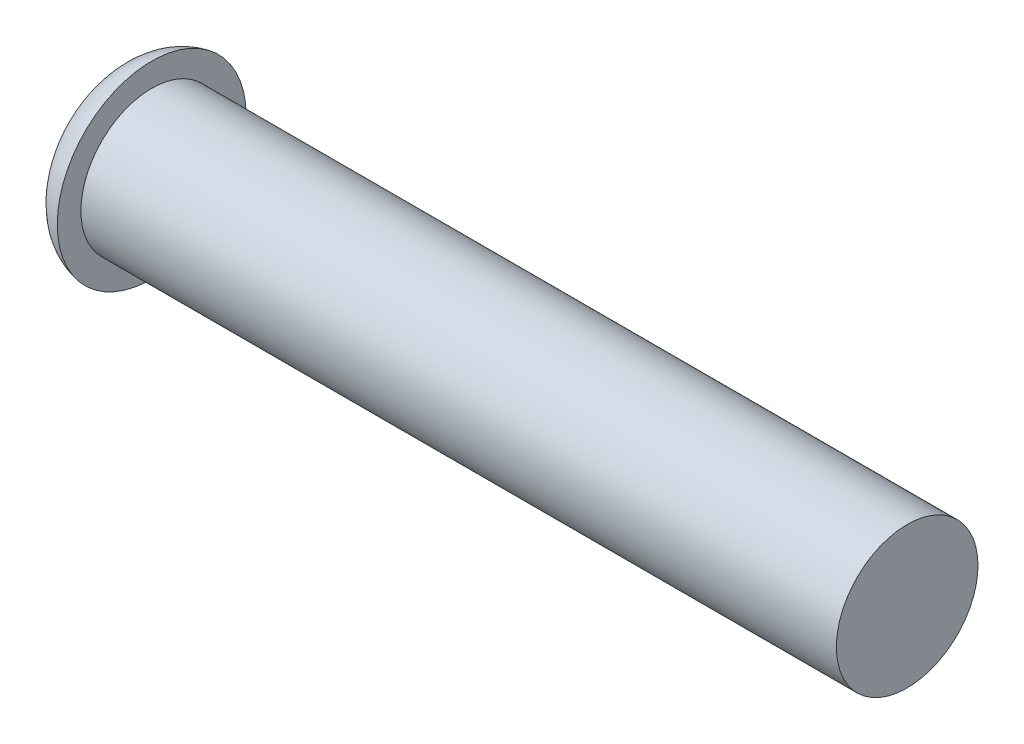
ISO-10303-21;
HEADER;
FILE_DESCRIPTION(('STEP AP214'),'2;1');
FILE_NAME('part.step','',(''),(''),'','','');
FILE_SCHEMA(('AUTOMOTIVE_DESIGN { 1 0 10303 214 1 1 1 1 }'));
ENDSEC;
DATA;
#1=APPLICATION_CONTEXT('core data for automotive mechanical design processes');
#2=APPLICATION_PROTOCOL_DEFINITION('international standard','automotive_design',2000,#1);
#3=PRODUCT_CONTEXT('',#1,'mechanical');
#4=PRODUCT('Part','Part','',(#3));
#5=PRODUCT_RELATED_PRODUCT_CATEGORY('part','',(#4));
#6=PRODUCT_DEFINITION_FORMATION('','',#4);
#7=PRODUCT_DEFINITION_CONTEXT('part definition',#1,'design');
#8=PRODUCT_DEFINITION('design','',#6,#7);
#9=PRODUCT_DEFINITION_SHAPE('','',#8);
#10=(LENGTH_UNIT() NAMED_UNIT(*) SI_UNIT(.MILLI.,.METRE.));
#11=(NAMED_UNIT(*) PLANE_ANGLE_UNIT() SI_UNIT($,.RADIAN.));
#12=(NAMED_UNIT(*) SI_UNIT($,.STERADIAN.) SOLID_ANGLE_UNIT());
#13=UNCERTAINTY_MEASURE_WITH_UNIT(LENGTH_MEASURE(1.E-05),#10,'distance_accuracy_value','');
#14=(GEOMETRIC_REPRESENTATION_CONTEXT(3) GLOBAL_UNCERTAINTY_ASSIGNED_CONTEXT((#13)) GLOBAL_UNIT_ASSIGNED_CONTEXT((#10,
#11,#12)) REPRESENTATION_CONTEXT('',''));
#15=CARTESIAN_POINT('',(0.,0.,0.));
#16=DIRECTION('',(0.,0.,1.));
#17=DIRECTION('',(1.,0.,0.));
#18=AXIS2_PLACEMENT_3D('',#15,#16,#17);
#19=CARTESIAN_POINT('',(-16.,0.,0.500000000000002));
#20=CARTESIAN_POINT('',(-16.5907632204088,0.,0.390621653032428));
#21=CARTESIAN_POINT('',(-16.8878814248423,0.,-0.197649900593243));
#22=CARTESIAN_POINT('',(-16.95,0.,-0.906049528648027));
#23=B_SPLINE_CURVE_WITH_KNOTS('',3,(#19,#20,#21,#22),.UNSPECIFIED.,.F.,.F.,(4,4),(0.,
0.787142653607902),.UNSPECIFIED.);
#24=CARTESIAN_POINT('',(0.,0.,-1.5));
#25=DIRECTION('',(1.,0.,0.));
#26=AXIS1_PLACEMENT('',#24,#25);
#27=SURFACE_OF_REVOLUTION('',#23,#26);
#28=CARTESIAN_POINT('',(-16.8406700147817,0.00249051510720299,-0.345302147456817));
#29=CARTESIAN_POINT('',(-16.8484361894896,0.0439514530330563,-0.369359013397947));
#30=CARTESIAN_POINT('',(-16.8550351469531,0.0855657965996936,-0.393504889841964));
#31=CARTESIAN_POINT('',(-16.8660936730975,0.168815245166832,-0.441808689129722));
#32=CARTESIAN_POINT('',(-16.8705628867563,0.210449385058824,-0.465966051988882));
#33=CARTESIAN_POINT('',(-16.8776141182286,0.293717368767331,-0.514280605915426));
#34=CARTESIAN_POINT('',(-16.8802013492028,0.335350891480739,-0.538437610669265));
#35=CARTESIAN_POINT('',(-16.8836316722371,0.418611900772203,-0.586748117832176));
#36=CARTESIAN_POINT('',(-16.8844772345343,0.460239312050741,-0.610901576550234));
#37=CARTESIAN_POINT('',(-16.8844772345343,0.543494134607818,-0.65920849398635));
#38=CARTESIAN_POINT('',(-16.8836316722371,0.585121545886356,-0.683361952704409));
#39=CARTESIAN_POINT('',(-16.8802013492028,0.66838255517782,-0.731672459867319));
#40=CARTESIAN_POINT('',(-16.8776141182286,0.710016077891228,-0.755829464621158));
#41=CARTESIAN_POINT('',(-16.8705628867563,0.793284061599735,-0.804144018547702));
#42=CARTESIAN_POINT('',(-16.8660936730975,0.834918201491727,-0.828301381406861));
#43=CARTESIAN_POINT('',(-16.8550351469531,0.918167650058865,-0.87660518069462));
#44=CARTESIAN_POINT('',(-16.8484361894896,0.959781993625503,-0.900751057138637));
#45=CARTESIAN_POINT('',(-16.8406700147817,1.00124293155136,-0.924807923079767));
#46=B_SPLINE_CURVE_WITH_KNOTS('',3,(#28,#29,#30,#31,#32,#33,#34,#35,#36,#37,#38,#39,#40,#41,#42,
#43,#44,#45),.UNSPECIFIED.,.F.,.F.,(4,2,2,2,2,2,2,2,4),(0.,0.145648166079068,0.29063031443825,
0.435209311528793,0.579583108271702,0.723956905014611,0.868535902105154,1.01351805046434,
1.1591662165434),.UNSPECIFIED.);
#47=CARTESIAN_POINT('',(-16.8406700147817,0.0024905151072029,-0.345302147456817));
#48=VERTEX_POINT('',#47);
#49=CARTESIAN_POINT('',(-16.8406700147817,1.00124293155133,-0.924807923079799));
#50=VERTEX_POINT('',#49);
#51=EDGE_CURVE('E11',#48,#50,#46,.T.);
#52=ORIENTED_EDGE('',*,*,#51,.F.);
#53=CARTESIAN_POINT('',(-16.8406700147817,-0.998752416444092,-0.920494224377047));
#54=CARTESIAN_POINT('',(-16.8484361894896,-0.957188090440714,-0.896616431839089));
#55=CARTESIAN_POINT('',(-16.8550351469531,-0.915469976260239,-0.872650291370576));
#56=CARTESIAN_POINT('',(-16.8660936730975,-0.832012934694172,-0.824706053704269));
#57=CARTESIAN_POINT('',(-16.8705628867563,-0.790274974823708,-0.80072851232267));
#58=CARTESIAN_POINT('',(-16.8776141182286,-0.706799351896558,-0.752773600072469));
#59=CARTESIAN_POINT('',(-16.8802013492028,-0.665062010743691,-0.728796414130542));
#60=CARTESIAN_POINT('',(-16.8836316722371,-0.581593379625173,-0.68084551852086));
#61=CARTESIAN_POINT('',(-16.8844772345343,-0.53986216514681,-0.656871852218894));
#62=CARTESIAN_POINT('',(-16.8844772345343,-0.456399736190082,-0.608924519614961));
#63=CARTESIAN_POINT('',(-16.8836316722371,-0.414668521711718,-0.584950853312995));
#64=CARTESIAN_POINT('',(-16.8802013492028,-0.3311998905932,-0.536999957703313));
#65=CARTESIAN_POINT('',(-16.8776141182286,-0.289462549440333,-0.513022771761386));
#66=CARTESIAN_POINT('',(-16.8705628867563,-0.205986926513184,-0.465067859511185));
#67=CARTESIAN_POINT('',(-16.8660936730975,-0.16424896664272,-0.441090318129586));
#68=CARTESIAN_POINT('',(-16.8550351469531,-0.0807919250766522,-0.39314608046328));
#69=CARTESIAN_POINT('',(-16.8484361894896,-0.0390738108961771,-0.369179939994769));
#70=CARTESIAN_POINT('',(-16.8406700147817,0.00249051510720208,-0.345302147456817));
#71=B_SPLINE_CURVE_WITH_KNOTS('',3,(#53,#54,#55,#56,#57,#58,#59,#60,#61,#62,#63,#64,#65,#66,#67,
#68,#69,#70),.UNSPECIFIED.,.F.,.F.,(4,2,2,2,2,2,2,2,4),(0.,0.145648166079057,0.29063031443823,
0.435209311528765,0.579583108271665,0.723956905014565,0.868535902105101,1.01351805046427,
1.15916621654333),.UNSPECIFIED.);
#72=CARTESIAN_POINT('',(-16.8406700147817,-0.998752416444131,-0.92049422437706));
#73=VERTEX_POINT('',#72);
#74=EDGE_CURVE('E47',#73,#48,#71,.T.);
#75=ORIENTED_EDGE('',*,*,#74,.F.);
#76=CARTESIAN_POINT('',(-16.8406700147817,-1.00124293155134,-2.07519207692024));
#77=CARTESIAN_POINT('',(-16.8484361894896,-1.00113954347381,-2.02725741844116));
#78=CARTESIAN_POINT('',(-16.8550351469531,-1.00103577285997,-1.97914540152863));
#79=CARTESIAN_POINT('',(-16.8660936730975,-1.00082817986103,-1.88289736457456));
#80=CARTESIAN_POINT('',(-16.8705628867563,-1.00072435988256,-1.8347624603338));
#81=CARTESIAN_POINT('',(-16.8776141182286,-1.00051672066391,-1.73849299415705));
#82=CARTESIAN_POINT('',(-16.8802013492028,-1.00041290222445,-1.69035880346129));
#83=CARTESIAN_POINT('',(-16.8836316722371,-1.00020528039739,-1.59409740068869));
#84=CARTESIAN_POINT('',(-16.8844772345343,-1.00010147719756,-1.54597027566867));
#85=CARTESIAN_POINT('',(-16.8844772345343,-0.999893870797905,-1.44971602562861));
#86=CARTESIAN_POINT('',(-16.8836316722371,-0.999790067598077,-1.40158890060859));
#87=CARTESIAN_POINT('',(-16.8802013492028,-0.999582445771018,-1.30532749783599));
#88=CARTESIAN_POINT('',(-16.8776141182286,-0.999478627331557,-1.25719330714023));
#89=CARTESIAN_POINT('',(-16.8705628867563,-0.999270988112909,-1.16092384096348));
#90=CARTESIAN_POINT('',(-16.8660936730975,-0.999167168134435,-1.11278893672272));
#91=CARTESIAN_POINT('',(-16.8550351469531,-0.9989595751355,-1.01654089976865));
#92=CARTESIAN_POINT('',(-16.8484361894896,-0.99885580452166,-0.968428882856124));
#93=CARTESIAN_POINT('',(-16.8406700147817,-0.998752416444131,-0.920494224377042));
#94=B_SPLINE_CURVE_WITH_KNOTS('',3,(#76,#77,#78,#79,#80,#81,#82,#83,#84,#85,#86,#87,#88,#89,#90,
#91,#92,#93),.UNSPECIFIED.,.F.,.F.,(4,2,2,2,2,2,2,2,4),(0.,0.145648166079067,0.290630314438247,
0.43520931152879,0.579583108271698,0.723956905014606,0.868535902105147,1.01351805046433,
1.15916621654339),.UNSPECIFIED.);
#95=CARTESIAN_POINT('',(-16.8406700147817,-1.00124293155134,-2.07519207692024));
#96=VERTEX_POINT('',#95);
#97=EDGE_CURVE('E197',#96,#73,#94,.T.);
#98=ORIENTED_EDGE('',*,*,#97,.F.);
#99=CARTESIAN_POINT('',(-16.8406700147817,-0.00249051510720344,-2.65469785254318));
#100=CARTESIAN_POINT('',(-16.8484361894896,-0.0439514530330555,-2.63064098660205));
#101=CARTESIAN_POINT('',(-16.8550351469531,-0.085565796599692,-2.60649511015803));
#102=CARTESIAN_POINT('',(-16.8660936730975,-0.168815245166829,-2.55819131087027));
#103=CARTESIAN_POINT('',(-16.8705628867563,-0.21044938505882,-2.53403394801112));
#104=CARTESIAN_POINT('',(-16.8776141182286,-0.293717368767326,-2.48571939408457));
#105=CARTESIAN_POINT('',(-16.8802013492028,-0.335350891480733,-2.46156238933073));
#106=CARTESIAN_POINT('',(-16.8836316722371,-0.418611900772195,-2.41325188216782));
#107=CARTESIAN_POINT('',(-16.8844772345343,-0.460239312050732,-2.38909842344977));
#108=CARTESIAN_POINT('',(-16.8844772345343,-0.543494134607806,-2.34079150601365));
#109=CARTESIAN_POINT('',(-16.8836316722371,-0.585121545886344,-2.31663804729559));
#110=CARTESIAN_POINT('',(-16.8802013492028,-0.668382555177806,-2.26832754013268));
#111=CARTESIAN_POINT('',(-16.8776141182286,-0.710016077891213,-2.24417053537885));
#112=CARTESIAN_POINT('',(-16.8705628867563,-0.793284061599719,-2.1958559814523));
#113=CARTESIAN_POINT('',(-16.8660936730975,-0.83491820149171,-2.17169861859314));
#114=CARTESIAN_POINT('',(-16.8550351469531,-0.918167650058846,-2.12339481930539));
#115=CARTESIAN_POINT('',(-16.8484361894896,-0.959781993625483,-2.09924894286137));
#116=CARTESIAN_POINT('',(-16.8406700147817,-1.00124293155134,-2.07519207692024));
#117=B_SPLINE_CURVE_WITH_KNOTS('',3,(#99,#100,#101,#102,#103,#104,#105,#106,#107,#108,#109,#110,
#111,#112,#113,#114,#115,#116),.UNSPECIFIED.,.F.,.F.,(4,2,2,2,2,2,2,2,4),(0.,0.145648166079065,
0.290630314438243,0.435209311528784,0.57958310827169,0.723956905014595,0.868535902105136,
1.01351805046431,1.15916621654338),.UNSPECIFIED.);
#118=CARTESIAN_POINT('',(-16.8406700147817,-0.00249051510720349,-2.65469785254318));
#119=VERTEX_POINT('',#118);
#120=EDGE_CURVE('E194',#119,#96,#117,.T.);
#121=ORIENTED_EDGE('',*,*,#120,.F.);
#122=CARTESIAN_POINT('',(-16.8406700147817,0.998752416444131,-2.07950577562294));
#123=CARTESIAN_POINT('',(-16.8484361894896,0.95718809044075,-2.10338356816089));
#124=CARTESIAN_POINT('',(-16.8550351469531,0.915469976260273,-2.1273497086294));
#125=CARTESIAN_POINT('',(-16.8660936730975,0.832012934694202,-2.17529394629571));
#126=CARTESIAN_POINT('',(-16.8705628867563,0.790274974823736,-2.19927148767731));
#127=CARTESIAN_POINT('',(-16.8776141182286,0.706799351896583,-2.24722639992751));
#128=CARTESIAN_POINT('',(-16.8802013492028,0.665062010743715,-2.27120358586944));
#129=CARTESIAN_POINT('',(-16.8836316722371,0.581593379625194,-2.31915448147912));
#130=CARTESIAN_POINT('',(-16.8844772345343,0.539862165146829,-2.34312814778109));
#131=CARTESIAN_POINT('',(-16.8844772345343,0.456399736190098,-2.39107548038502));
#132=CARTESIAN_POINT('',(-16.8836316722371,0.414668521711733,-2.41504914668699));
#133=CARTESIAN_POINT('',(-16.8802013492028,0.331199890593212,-2.46300004229668));
#134=CARTESIAN_POINT('',(-16.8776141182286,0.289462549440343,-2.4869772282386));
#135=CARTESIAN_POINT('',(-16.8705628867563,0.205986926513191,-2.53493214048881));
#136=CARTESIAN_POINT('',(-16.8660936730975,0.164248966642725,-2.55890968187041));
#137=CARTESIAN_POINT('',(-16.8550351469531,0.0807919250766538,-2.60685391953671));
#138=CARTESIAN_POINT('',(-16.8484361894896,0.0390738108961767,-2.63082006000523));
#139=CARTESIAN_POINT('',(-16.8406700147817,-0.00249051510720398,-2.65469785254318));
#140=B_SPLINE_CURVE_WITH_KNOTS('',3,(#122,#123,#124,#125,#126,#127,#128,#129,#130,#131,#132,
#133,#134,#135,#136,#137,#138,#139),.UNSPECIFIED.,.F.,.F.,(4,2,2,2,2,2,2,2,4),(0.,
0.145648166079065,0.290630314438243,0.435209311528783,0.579583108271689,0.723956905014594,
0.868535902105135,1.01351805046431,1.15916621654338),.UNSPECIFIED.);
#141=CARTESIAN_POINT('',(-16.8406700147817,0.998752416444131,-2.07950577562294));
#142=VERTEX_POINT('',#141);
#143=EDGE_CURVE('E152',#142,#119,#140,.T.);
#144=ORIENTED_EDGE('',*,*,#143,.F.);
#145=CARTESIAN_POINT('',(-16.8406700147817,1.00124293155133,-0.924807923079799));
#146=CARTESIAN_POINT('',(-16.8484361894896,1.0011395434738,-0.972742581558881));
#147=CARTESIAN_POINT('',(-16.8550351469531,1.00103577285996,-1.02085459847141));
#148=CARTESIAN_POINT('',(-16.8660936730975,1.00082817986103,-1.11710263542547));
#149=CARTESIAN_POINT('',(-16.8705628867563,1.00072435988256,-1.16523753966623));
#150=CARTESIAN_POINT('',(-16.8776141182286,1.00051672066391,-1.26150700584297));
#151=CARTESIAN_POINT('',(-16.8802013492028,1.00041290222445,-1.30964119653873));
#152=CARTESIAN_POINT('',(-16.8836316722371,1.00020528039739,-1.40590259931132));
#153=CARTESIAN_POINT('',(-16.8844772345343,1.00010147719756,-1.45402972433135));
#154=CARTESIAN_POINT('',(-16.8844772345343,0.999893870797904,-1.55028397437139));
#155=CARTESIAN_POINT('',(-16.8836316722371,0.999790067598076,-1.59841109939141));
#156=CARTESIAN_POINT('',(-16.8802013492028,0.999582445771018,-1.694672502164));
#157=CARTESIAN_POINT('',(-16.8776141182286,0.999478627331556,-1.74280669285977));
#158=CARTESIAN_POINT('',(-16.8705628867563,0.999270988112909,-1.83907615903651));
#159=CARTESIAN_POINT('',(-16.8660936730975,0.999167168134435,-1.88721106327727));
#160=CARTESIAN_POINT('',(-16.8550351469531,0.9989595751355,-1.98345910023133));
#161=CARTESIAN_POINT('',(-16.8484361894896,0.998855804521659,-2.03157111714386));
#162=CARTESIAN_POINT('',(-16.8406700147817,0.998752416444131,-2.07950577562294));
#163=B_SPLINE_CURVE_WITH_KNOTS('',3,(#145,#146,#147,#148,#149,#150,#151,#152,#153,#154,#155,
#156,#157,#158,#159,#160,#161,#162),.UNSPECIFIED.,.F.,.F.,(4,2,2,2,2,2,2,2,4),(0.,
0.145648166079058,0.290630314438231,0.435209311528764,0.579583108271665,0.723956905014565,
0.8685359021051,1.01351805046427,1.15916621654333),.UNSPECIFIED.);
#164=EDGE_CURVE('E146',#50,#142,#163,.T.);
#165=ORIENTED_EDGE('',*,*,#164,.F.);
#166=EDGE_LOOP('',(#52,#75,#98,#121,#144,#165));
#167=FACE_BOUND('',#166,.T.);
#168=CARTESIAN_POINT('',(-16.,0.,-1.5));
#169=DIRECTION('',(1.,0.,0.));
#170=DIRECTION('',(0.,0.,-1.));
#171=AXIS2_PLACEMENT_3D('',#168,#169,#170);
#172=CIRCLE('',#171,2.);
#173=CARTESIAN_POINT('',(-16.,0.,-3.5));
#174=VERTEX_POINT('',#173);
#175=EDGE_CURVE('E143',#174,#174,#172,.T.);
#176=ORIENTED_EDGE('',*,*,#175,.F.);
#177=EDGE_LOOP('',(#176));
#178=FACE_BOUND('',#177,.T.);
#179=ADVANCED_FACE('F34',(#167,#178),#27,.F.);
#180=CARTESIAN_POINT('',(0.,0.,-1.5));
#181=DIRECTION('',(1.,0.,0.));
#182=DIRECTION('',(0.,0.,-1.));
#183=AXIS2_PLACEMENT_3D('',#180,#181,#182);
#184=CYLINDRICAL_SURFACE('',#183,1.5);
#185=CARTESIAN_POINT('',(-16.,0.,-1.5));
#186=DIRECTION('',(1.,0.,0.));
#187=DIRECTION('',(0.,0.,-1.));
#188=AXIS2_PLACEMENT_3D('',#185,#186,#187);
#189=CIRCLE('',#188,1.5);
#190=CARTESIAN_POINT('',(-16.,0.,-3.));
#191=VERTEX_POINT('',#190);
#192=EDGE_CURVE('E140',#191,#191,#189,.T.);
#193=ORIENTED_EDGE('',*,*,#192,.T.);
#194=EDGE_LOOP('',(#193));
#195=FACE_BOUND('',#194,.T.);
#196=CARTESIAN_POINT('',(0.,0.,-1.5));
#197=DIRECTION('',(1.,0.,0.));
#198=DIRECTION('',(0.,0.,-1.));
#199=AXIS2_PLACEMENT_3D('',#196,#197,#198);
#200=CIRCLE('',#199,1.5);
#201=CARTESIAN_POINT('',(0.,0.,-3.));
#202=VERTEX_POINT('',#201);
#203=EDGE_CURVE('E122',#202,#202,#200,.T.);
#204=ORIENTED_EDGE('',*,*,#203,.F.);
#205=EDGE_LOOP('',(#204));
#206=FACE_BOUND('',#205,.T.);
#207=ADVANCED_FACE('F171',(#195,#206),#184,.T.);
#208=CARTESIAN_POINT('',(0.,0.,0.));
#209=DIRECTION('',(-1.,0.,0.));
#210=DIRECTION('',(0.,0.,1.));
#211=AXIS2_PLACEMENT_3D('',#208,#209,#210);
#212=PLANE('',#211);
#213=ORIENTED_EDGE('',*,*,#203,.T.);
#214=EDGE_LOOP('',(#213));
#215=FACE_BOUND('',#214,.T.);
#216=ADVANCED_FACE('F168',(#215),#212,.F.);
#217=CARTESIAN_POINT('',(-16.,0.,0.));
#218=DIRECTION('',(1.,0.,0.));
#219=DIRECTION('',(0.,0.,-1.));
#220=AXIS2_PLACEMENT_3D('',#217,#218,#219);
#221=PLANE('',#220);
#222=ORIENTED_EDGE('',*,*,#175,.T.);
#223=EDGE_LOOP('',(#222));
#224=FACE_BOUND('',#223,.T.);
#225=ORIENTED_EDGE('',*,*,#192,.F.);
#226=EDGE_LOOP('',(#225));
#227=FACE_BOUND('',#226,.T.);
#228=ADVANCED_FACE('F167',(#224,#227),#221,.T.);
#229=CARTESIAN_POINT('',(-15.45,0.0024905151072029,-0.345302147456817));
#230=DIRECTION('',(0.,0.501866723329269,0.864944964731712));
#231=DIRECTION('',(0.,-0.864944964731712,0.501866723329269));
#232=AXIS2_PLACEMENT_3D('',#229,#230,#231);
#233=PLANE('',#232);
#234=ORIENTED_EDGE('',*,*,#51,.T.);
#235=DIRECTION('',(-1.,0.,0.));
#236=VECTOR('',#235,1.);
#237=CARTESIAN_POINT('',(-15.45,1.00124293155133,-0.924807923079755));
#238=LINE('',#237,#236);
#239=CARTESIAN_POINT('',(-15.45,1.00124293155133,-0.924807923079755));
#240=VERTEX_POINT('',#239);
#241=EDGE_CURVE('E54',#240,#50,#238,.T.);
#242=ORIENTED_EDGE('',*,*,#241,.F.);
#243=DIRECTION('',(0.,0.864944964731712,-0.501866723329269));
#244=VECTOR('',#243,1.);
#245=CARTESIAN_POINT('',(-15.45,0.0024905151072029,-0.345302147456817));
#246=LINE('',#245,#244);
#247=CARTESIAN_POINT('',(-15.45,0.0024905151072029,-0.345302147456817));
#248=VERTEX_POINT('',#247);
#249=EDGE_CURVE('E92',#248,#240,#246,.T.);
#250=ORIENTED_EDGE('',*,*,#249,.F.);
#251=DIRECTION('',(-1.,0.,0.));
#252=VECTOR('',#251,1.);
#253=CARTESIAN_POINT('',(-15.45,0.0024905151072029,-0.345302147456817));
#254=LINE('',#253,#252);
#255=EDGE_CURVE('E120',#248,#48,#254,.T.);
#256=ORIENTED_EDGE('',*,*,#255,.T.);
#257=EDGE_LOOP('',(#234,#242,#250,#256));
#258=FACE_BOUND('',#257,.T.);
#259=ADVANCED_FACE('F90',(#258),#233,.F.);
#260=CARTESIAN_POINT('',(-15.45,-0.998752416444131,-0.92049422437706));
#261=DIRECTION('',(0.,-0.498130950668464,0.867101814083059));
#262=DIRECTION('',(0.,-0.86710181408306,-0.498130950668464));
#263=AXIS2_PLACEMENT_3D('',#260,#261,#262);
#264=PLANE('',#263);
#265=ORIENTED_EDGE('',*,*,#74,.T.);
#266=ORIENTED_EDGE('',*,*,#255,.F.);
#267=DIRECTION('',(0.,0.86710181408306,0.498130950668464));
#268=VECTOR('',#267,1.);
#269=CARTESIAN_POINT('',(-15.45,-0.998752416444131,-0.92049422437706));
#270=LINE('',#269,#268);
#271=CARTESIAN_POINT('',(-15.45,-0.998752416444131,-0.92049422437706));
#272=VERTEX_POINT('',#271);
#273=EDGE_CURVE('E97',#272,#248,#270,.T.);
#274=ORIENTED_EDGE('',*,*,#273,.F.);
#275=DIRECTION('',(-1.,0.,0.));
#276=VECTOR('',#275,1.);
#277=CARTESIAN_POINT('',(-15.45,-0.998752416444131,-0.92049422437706));
#278=LINE('',#277,#276);
#279=EDGE_CURVE('E123',#272,#73,#278,.T.);
#280=ORIENTED_EDGE('',*,*,#279,.T.);
#281=EDGE_LOOP('',(#265,#266,#274,#280));
#282=FACE_BOUND('',#281,.T.);
#283=ADVANCED_FACE('F166',(#282),#264,.F.);
#284=CARTESIAN_POINT('',(-15.45,-1.00124293155134,-2.07519207692024));
#285=DIRECTION('',(0.,-0.999997673997733,0.00215684935134743));
#286=DIRECTION('',(0.,-0.00215684935134743,-0.999997673997733));
#287=AXIS2_PLACEMENT_3D('',#284,#285,#286);
#288=PLANE('',#287);
#289=ORIENTED_EDGE('',*,*,#97,.T.);
#290=ORIENTED_EDGE('',*,*,#279,.F.);
#291=DIRECTION('',(0.,0.00215684935134743,0.999997673997733));
#292=VECTOR('',#291,1.);
#293=CARTESIAN_POINT('',(-15.45,-1.00124293155134,-2.07519207692024));
#294=LINE('',#293,#292);
#295=CARTESIAN_POINT('',(-15.45,-1.00124293155134,-2.07519207692024));
#296=VERTEX_POINT('',#295);
#297=EDGE_CURVE('E117',#296,#272,#294,.T.);
#298=ORIENTED_EDGE('',*,*,#297,.F.);
#299=DIRECTION('',(-1.,0.,0.));
#300=VECTOR('',#299,1.);
#301=CARTESIAN_POINT('',(-15.45,-1.00124293155134,-2.07519207692024));
#302=LINE('',#301,#300);
#303=EDGE_CURVE('E125',#296,#96,#302,.T.);
#304=ORIENTED_EDGE('',*,*,#303,.T.);
#305=EDGE_LOOP('',(#289,#290,#298,#304));
#306=FACE_BOUND('',#305,.T.);
#307=ADVANCED_FACE('F196',(#306),#288,.F.);
#308=CARTESIAN_POINT('',(-15.45,-0.00249051510720349,-2.65469785254318));
#309=DIRECTION('',(0.,-0.501866723329269,-0.864944964731712));
#310=DIRECTION('',(0.,0.864944964731712,-0.501866723329269));
#311=AXIS2_PLACEMENT_3D('',#308,#309,#310);
#312=PLANE('',#311);
#313=ORIENTED_EDGE('',*,*,#120,.T.);
#314=ORIENTED_EDGE('',*,*,#303,.F.);
#315=DIRECTION('',(0.,-0.864944964731712,0.501866723329269));
#316=VECTOR('',#315,1.);
#317=CARTESIAN_POINT('',(-15.45,-0.00249051510720349,-2.65469785254318));
#318=LINE('',#317,#316);
#319=CARTESIAN_POINT('',(-15.45,-0.00249051510720349,-2.65469785254318));
#320=VERTEX_POINT('',#319);
#321=EDGE_CURVE('E114',#320,#296,#318,.T.);
#322=ORIENTED_EDGE('',*,*,#321,.F.);
#323=DIRECTION('',(-1.,0.,0.));
#324=VECTOR('',#323,1.);
#325=CARTESIAN_POINT('',(-15.45,-0.00249051510720349,-2.65469785254318));
#326=LINE('',#325,#324);
#327=EDGE_CURVE('E128',#320,#119,#326,.T.);
#328=ORIENTED_EDGE('',*,*,#327,.T.);
#329=EDGE_LOOP('',(#313,#314,#322,#328));
#330=FACE_BOUND('',#329,.T.);
#331=ADVANCED_FACE('F193',(#330),#312,.F.);
#332=CARTESIAN_POINT('',(-15.45,0.998752416444131,-2.07950577562294));
#333=DIRECTION('',(0.,0.498130950668463,-0.86710181408306));
#334=DIRECTION('',(0.,0.86710181408306,0.498130950668463));
#335=AXIS2_PLACEMENT_3D('',#332,#333,#334);
#336=PLANE('',#335);
#337=ORIENTED_EDGE('',*,*,#143,.T.);
#338=ORIENTED_EDGE('',*,*,#327,.F.);
#339=DIRECTION('',(0.,-0.86710181408306,-0.498130950668463));
#340=VECTOR('',#339,1.);
#341=CARTESIAN_POINT('',(-15.45,0.998752416444131,-2.07950577562294));
#342=LINE('',#341,#340);
#343=CARTESIAN_POINT('',(-15.45,0.998752416444131,-2.07950577562294));
#344=VERTEX_POINT('',#343);
#345=EDGE_CURVE('E106',#344,#320,#342,.T.);
#346=ORIENTED_EDGE('',*,*,#345,.F.);
#347=DIRECTION('',(-1.,0.,0.));
#348=VECTOR('',#347,1.);
#349=CARTESIAN_POINT('',(-15.45,0.998752416444131,-2.07950577562294));
#350=LINE('',#349,#348);
#351=EDGE_CURVE('E96',#344,#142,#350,.T.);
#352=ORIENTED_EDGE('',*,*,#351,.T.);
#353=EDGE_LOOP('',(#337,#338,#346,#352));
#354=FACE_BOUND('',#353,.T.);
#355=ADVANCED_FACE('F160',(#354),#336,.F.);
#356=CARTESIAN_POINT('',(-15.45,1.00124293155133,-0.924807923079755));
#357=DIRECTION('',(0.,0.999997673997733,-0.00215684935134705));
#358=DIRECTION('',(0.,0.00215684935134705,0.999997673997733));
#359=AXIS2_PLACEMENT_3D('',#356,#357,#358);
#360=PLANE('',#359);
#361=ORIENTED_EDGE('',*,*,#164,.T.);
#362=ORIENTED_EDGE('',*,*,#351,.F.);
#363=DIRECTION('',(0.,-0.00215684935134705,-0.999997673997733));
#364=VECTOR('',#363,1.);
#365=CARTESIAN_POINT('',(-15.45,1.00124293155133,-0.924807923079755));
#366=LINE('',#365,#364);
#367=EDGE_CURVE('E100',#240,#344,#366,.T.);
#368=ORIENTED_EDGE('',*,*,#367,.F.);
#369=ORIENTED_EDGE('',*,*,#241,.T.);
#370=EDGE_LOOP('',(#361,#362,#368,#369));
#371=FACE_BOUND('',#370,.T.);
#372=ADVANCED_FACE('F101',(#371),#360,.F.);
#373=CARTESIAN_POINT('',(-15.45,0.,0.));
#374=DIRECTION('',(-1.,0.,0.));
#375=DIRECTION('',(0.,0.,1.));
#376=AXIS2_PLACEMENT_3D('',#373,#374,#375);
#377=PLANE('',#376);
#378=ORIENTED_EDGE('',*,*,#249,.T.);
#379=ORIENTED_EDGE('',*,*,#367,.T.);
#380=ORIENTED_EDGE('',*,*,#345,.T.);
#381=ORIENTED_EDGE('',*,*,#321,.T.);
#382=ORIENTED_EDGE('',*,*,#297,.T.);
#383=ORIENTED_EDGE('',*,*,#273,.T.);
#384=EDGE_LOOP('',(#378,#379,#380,#381,#382,#383));
#385=FACE_BOUND('',#384,.T.);
#386=ADVANCED_FACE('F108',(#385),#377,.T.);
#387=CLOSED_SHELL('',(#179,#207,#216,#228,#259,#283,#307,#331,#355,#372,#386));
#388=MANIFOLD_SOLID_BREP('B2',#387);
#389=ADVANCED_BREP_SHAPE_REPRESENTATION('',(#18,#388),#14);
#390=SHAPE_DEFINITION_REPRESENTATION(#9,#389);
ENDSEC;
END-ISO-10303-21;
